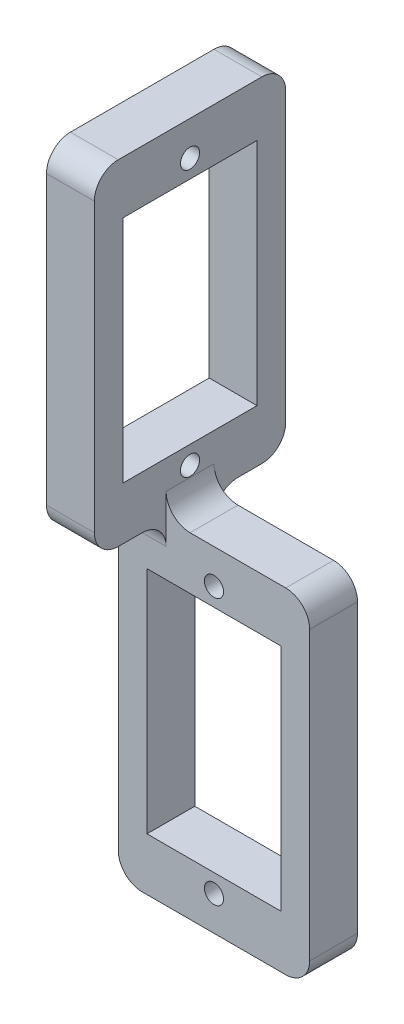
ISO-10303-21;
HEADER;
FILE_DESCRIPTION(('STEP AP214'),'2;1');
FILE_NAME('part.step','',(''),(''),'','','');
FILE_SCHEMA(('AUTOMOTIVE_DESIGN { 1 0 10303 214 1 1 1 1 }'));
ENDSEC;
DATA;
#1=APPLICATION_CONTEXT('core data for automotive mechanical design processes');
#2=APPLICATION_PROTOCOL_DEFINITION('international standard','automotive_design',2000,#1);
#3=PRODUCT_CONTEXT('',#1,'mechanical');
#4=PRODUCT('Part','Part','',(#3));
#5=PRODUCT_RELATED_PRODUCT_CATEGORY('part','',(#4));
#6=PRODUCT_DEFINITION_FORMATION('','',#4);
#7=PRODUCT_DEFINITION_CONTEXT('part definition',#1,'design');
#8=PRODUCT_DEFINITION('design','',#6,#7);
#9=PRODUCT_DEFINITION_SHAPE('','',#8);
#10=(LENGTH_UNIT() NAMED_UNIT(*) SI_UNIT(.MILLI.,.METRE.));
#11=(NAMED_UNIT(*) PLANE_ANGLE_UNIT() SI_UNIT($,.RADIAN.));
#12=(NAMED_UNIT(*) SI_UNIT($,.STERADIAN.) SOLID_ANGLE_UNIT());
#13=UNCERTAINTY_MEASURE_WITH_UNIT(LENGTH_MEASURE(1.E-05),#10,'distance_accuracy_value','');
#14=(GEOMETRIC_REPRESENTATION_CONTEXT(3) GLOBAL_UNCERTAINTY_ASSIGNED_CONTEXT((#13)) GLOBAL_UNIT_ASSIGNED_CONTEXT((#10,
#11,#12)) REPRESENTATION_CONTEXT('',''));
#15=CARTESIAN_POINT('',(0.,0.,0.));
#16=DIRECTION('',(0.,0.,1.));
#17=DIRECTION('',(1.,0.,0.));
#18=AXIS2_PLACEMENT_3D('',#15,#16,#17);
#19=CARTESIAN_POINT('',(0.,0.,5.));
#20=DIRECTION('',(0.,0.,-1.));
#21=DIRECTION('',(-1.,0.,0.));
#22=AXIS2_PLACEMENT_3D('',#19,#20,#21);
#23=PLANE('',#22);
#24=CARTESIAN_POINT('',(0.,13.9,5.));
#25=DIRECTION('',(0.,0.,1.));
#26=DIRECTION('',(1.,0.,0.));
#27=AXIS2_PLACEMENT_3D('',#24,#25,#26);
#28=CIRCLE('',#27,1.);
#29=CARTESIAN_POINT('',(1.,13.9,5.));
#30=VERTEX_POINT('',#29);
#31=EDGE_CURVE('E293',#30,#30,#28,.T.);
#32=ORIENTED_EDGE('',*,*,#31,.F.);
#33=EDGE_LOOP('',(#32));
#34=FACE_BOUND('',#33,.T.);
#35=CARTESIAN_POINT('',(0.,-13.9,5.));
#36=DIRECTION('',(0.,0.,1.));
#37=DIRECTION('',(-1.,0.,0.));
#38=AXIS2_PLACEMENT_3D('',#35,#36,#37);
#39=CIRCLE('',#38,1.);
#40=CARTESIAN_POINT('',(-1.,-13.9,5.));
#41=VERTEX_POINT('',#40);
#42=EDGE_CURVE('E278',#41,#41,#39,.T.);
#43=ORIENTED_EDGE('',*,*,#42,.F.);
#44=EDGE_LOOP('',(#43));
#45=FACE_BOUND('',#44,.T.);
#46=DIRECTION('',(0.,1.,0.));
#47=VECTOR('',#46,1.);
#48=CARTESIAN_POINT('',(10.,-17.5,5.));
#49=LINE('',#48,#47);
#50=CARTESIAN_POINT('',(10.,-15.,5.));
#51=VERTEX_POINT('',#50);
#52=CARTESIAN_POINT('',(10.,15.,5.));
#53=VERTEX_POINT('',#52);
#54=EDGE_CURVE('E332',#51,#53,#49,.T.);
#55=ORIENTED_EDGE('',*,*,#54,.T.);
#56=CARTESIAN_POINT('',(7.5,15.,5.));
#57=DIRECTION('',(0.,0.,-1.));
#58=DIRECTION('',(-1.,0.,0.));
#59=AXIS2_PLACEMENT_3D('',#56,#57,#58);
#60=CIRCLE('',#59,2.5);
#61=CARTESIAN_POINT('',(7.5,17.5,5.));
#62=VERTEX_POINT('',#61);
#63=EDGE_CURVE('E442',#53,#62,#60,.F.);
#64=ORIENTED_EDGE('',*,*,#63,.T.);
#65=DIRECTION('',(-1.,0.,0.));
#66=VECTOR('',#65,1.);
#67=CARTESIAN_POINT('',(-10.,17.5,5.));
#68=LINE('',#67,#66);
#69=CARTESIAN_POINT('',(-2.5,17.5,5.));
#70=VERTEX_POINT('',#69);
#71=EDGE_CURVE('E335',#62,#70,#68,.T.);
#72=ORIENTED_EDGE('',*,*,#71,.T.);
#73=CARTESIAN_POINT('',(-2.5,20.,5.));
#74=DIRECTION('',(0.,0.,-1.));
#75=DIRECTION('',(-1.,0.,0.));
#76=AXIS2_PLACEMENT_3D('',#73,#74,#75);
#77=CIRCLE('',#76,2.5);
#78=CARTESIAN_POINT('',(-5.,20.,5.));
#79=VERTEX_POINT('',#78);
#80=EDGE_CURVE('E45',#70,#79,#77,.T.);
#81=ORIENTED_EDGE('',*,*,#80,.T.);
#82=DIRECTION('',(0.,-1.,0.));
#83=VECTOR('',#82,1.);
#84=CARTESIAN_POINT('',(-5.,0.,5.));
#85=LINE('',#84,#83);
#86=CARTESIAN_POINT('',(-5.,15.,5.));
#87=VERTEX_POINT('',#86);
#88=EDGE_CURVE('E345',#79,#87,#85,.T.);
#89=ORIENTED_EDGE('',*,*,#88,.T.);
#90=DIRECTION('',(-1.,0.,0.));
#91=VECTOR('',#90,1.);
#92=CARTESIAN_POINT('',(0.,15.,5.));
#93=LINE('',#92,#91);
#94=CARTESIAN_POINT('',(-10.,15.,5.));
#95=VERTEX_POINT('',#94);
#96=EDGE_CURVE('E358',#87,#95,#93,.T.);
#97=ORIENTED_EDGE('',*,*,#96,.T.);
#98=DIRECTION('',(0.,-1.,0.));
#99=VECTOR('',#98,1.);
#100=CARTESIAN_POINT('',(-10.,-17.5,5.));
#101=LINE('',#100,#99);
#102=CARTESIAN_POINT('',(-10.,-15.,5.));
#103=VERTEX_POINT('',#102);
#104=EDGE_CURVE('E339',#95,#103,#101,.T.);
#105=ORIENTED_EDGE('',*,*,#104,.T.);
#106=CARTESIAN_POINT('',(-7.5,-15.,5.));
#107=DIRECTION('',(0.,0.,-1.));
#108=DIRECTION('',(-1.,0.,0.));
#109=AXIS2_PLACEMENT_3D('',#106,#107,#108);
#110=CIRCLE('',#109,2.5);
#111=CARTESIAN_POINT('',(-7.5,-17.5,5.));
#112=VERTEX_POINT('',#111);
#113=EDGE_CURVE('E440',#103,#112,#110,.F.);
#114=ORIENTED_EDGE('',*,*,#113,.T.);
#115=DIRECTION('',(1.,0.,0.));
#116=VECTOR('',#115,1.);
#117=CARTESIAN_POINT('',(-10.,-17.5,5.));
#118=LINE('',#117,#116);
#119=CARTESIAN_POINT('',(7.5,-17.5,5.));
#120=VERTEX_POINT('',#119);
#121=EDGE_CURVE('E342',#112,#120,#118,.T.);
#122=ORIENTED_EDGE('',*,*,#121,.T.);
#123=CARTESIAN_POINT('',(7.5,-15.,5.));
#124=DIRECTION('',(0.,0.,-1.));
#125=DIRECTION('',(-1.,0.,0.));
#126=AXIS2_PLACEMENT_3D('',#123,#124,#125);
#127=CIRCLE('',#126,2.5);
#128=EDGE_CURVE('E438',#120,#51,#127,.F.);
#129=ORIENTED_EDGE('',*,*,#128,.T.);
#130=EDGE_LOOP('',(#55,#64,#72,#81,#89,#97,#105,#114,#122,#129));
#131=FACE_BOUND('',#130,.T.);
#132=DIRECTION('',(0.,1.,0.));
#133=VECTOR('',#132,1.);
#134=CARTESIAN_POINT('',(7.,-12.,5.));
#135=LINE('',#134,#133);
#136=CARTESIAN_POINT('',(7.,-12.,5.));
#137=VERTEX_POINT('',#136);
#138=CARTESIAN_POINT('',(7.,12.,5.));
#139=VERTEX_POINT('',#138);
#140=EDGE_CURVE('E301',#137,#139,#135,.T.);
#141=ORIENTED_EDGE('',*,*,#140,.F.);
#142=DIRECTION('',(1.,0.,0.));
#143=VECTOR('',#142,1.);
#144=CARTESIAN_POINT('',(-7.,-12.,5.));
#145=LINE('',#144,#143);
#146=CARTESIAN_POINT('',(-7.,-12.,5.));
#147=VERTEX_POINT('',#146);
#148=EDGE_CURVE('E309',#147,#137,#145,.T.);
#149=ORIENTED_EDGE('',*,*,#148,.F.);
#150=DIRECTION('',(0.,-1.,0.));
#151=VECTOR('',#150,1.);
#152=CARTESIAN_POINT('',(-7.,-12.,5.));
#153=LINE('',#152,#151);
#154=CARTESIAN_POINT('',(-7.,12.,5.));
#155=VERTEX_POINT('',#154);
#156=EDGE_CURVE('E306',#155,#147,#153,.T.);
#157=ORIENTED_EDGE('',*,*,#156,.F.);
#158=DIRECTION('',(-1.,0.,0.));
#159=VECTOR('',#158,1.);
#160=CARTESIAN_POINT('',(-7.,12.,5.));
#161=LINE('',#160,#159);
#162=EDGE_CURVE('E303',#139,#155,#161,.T.);
#163=ORIENTED_EDGE('',*,*,#162,.F.);
#164=EDGE_LOOP('',(#141,#149,#157,#163));
#165=FACE_BOUND('',#164,.T.);
#166=ADVANCED_FACE('F37',(#34,#45,#131,#165),#23,.F.);
#167=CARTESIAN_POINT('',(0.,0.,0.));
#168=DIRECTION('',(0.,0.,-1.));
#169=DIRECTION('',(-1.,0.,0.));
#170=AXIS2_PLACEMENT_3D('',#167,#168,#169);
#171=PLANE('',#170);
#172=CARTESIAN_POINT('',(0.,13.9,0.));
#173=DIRECTION('',(0.,0.,1.));
#174=DIRECTION('',(1.,0.,0.));
#175=AXIS2_PLACEMENT_3D('',#172,#173,#174);
#176=CIRCLE('',#175,1.);
#177=CARTESIAN_POINT('',(1.,13.9,0.));
#178=VERTEX_POINT('',#177);
#179=EDGE_CURVE('E289',#178,#178,#176,.T.);
#180=ORIENTED_EDGE('',*,*,#179,.T.);
#181=EDGE_LOOP('',(#180));
#182=FACE_BOUND('',#181,.T.);
#183=CARTESIAN_POINT('',(0.,-13.9,0.));
#184=DIRECTION('',(0.,0.,1.));
#185=DIRECTION('',(-1.,0.,0.));
#186=AXIS2_PLACEMENT_3D('',#183,#184,#185);
#187=CIRCLE('',#186,1.);
#188=CARTESIAN_POINT('',(-1.,-13.9,0.));
#189=VERTEX_POINT('',#188);
#190=EDGE_CURVE('E296',#189,#189,#187,.T.);
#191=ORIENTED_EDGE('',*,*,#190,.T.);
#192=EDGE_LOOP('',(#191));
#193=FACE_BOUND('',#192,.T.);
#194=DIRECTION('',(-1.,0.,0.));
#195=VECTOR('',#194,1.);
#196=CARTESIAN_POINT('',(-10.,17.5,0.));
#197=LINE('',#196,#195);
#198=CARTESIAN_POINT('',(7.5,17.5,0.));
#199=VERTEX_POINT('',#198);
#200=CARTESIAN_POINT('',(-2.5,17.5,0.));
#201=VERTEX_POINT('',#200);
#202=EDGE_CURVE('E348',#199,#201,#197,.T.);
#203=ORIENTED_EDGE('',*,*,#202,.F.);
#204=CARTESIAN_POINT('',(7.5,15.,0.));
#205=DIRECTION('',(0.,0.,-1.));
#206=DIRECTION('',(-1.,0.,0.));
#207=AXIS2_PLACEMENT_3D('',#204,#205,#206);
#208=CIRCLE('',#207,2.5);
#209=CARTESIAN_POINT('',(10.,15.,0.));
#210=VERTEX_POINT('',#209);
#211=EDGE_CURVE('E431',#199,#210,#208,.T.);
#212=ORIENTED_EDGE('',*,*,#211,.T.);
#213=DIRECTION('',(0.,1.,0.));
#214=VECTOR('',#213,1.);
#215=CARTESIAN_POINT('',(10.,-17.5,0.));
#216=LINE('',#215,#214);
#217=CARTESIAN_POINT('',(10.,-15.,0.));
#218=VERTEX_POINT('',#217);
#219=EDGE_CURVE('E331',#218,#210,#216,.T.);
#220=ORIENTED_EDGE('',*,*,#219,.F.);
#221=CARTESIAN_POINT('',(7.5,-15.,0.));
#222=DIRECTION('',(0.,0.,-1.));
#223=DIRECTION('',(-1.,0.,0.));
#224=AXIS2_PLACEMENT_3D('',#221,#222,#223);
#225=CIRCLE('',#224,2.5);
#226=CARTESIAN_POINT('',(7.5,-17.5,0.));
#227=VERTEX_POINT('',#226);
#228=EDGE_CURVE('E427',#218,#227,#225,.T.);
#229=ORIENTED_EDGE('',*,*,#228,.T.);
#230=DIRECTION('',(1.,0.,0.));
#231=VECTOR('',#230,1.);
#232=CARTESIAN_POINT('',(-10.,-17.5,0.));
#233=LINE('',#232,#231);
#234=CARTESIAN_POINT('',(-7.5,-17.5,0.));
#235=VERTEX_POINT('',#234);
#236=EDGE_CURVE('E336',#235,#227,#233,.T.);
#237=ORIENTED_EDGE('',*,*,#236,.F.);
#238=CARTESIAN_POINT('',(-7.5,-15.,0.));
#239=DIRECTION('',(0.,0.,-1.));
#240=DIRECTION('',(-1.,0.,0.));
#241=AXIS2_PLACEMENT_3D('',#238,#239,#240);
#242=CIRCLE('',#241,2.5);
#243=CARTESIAN_POINT('',(-10.,-15.,0.));
#244=VERTEX_POINT('',#243);
#245=EDGE_CURVE('E429',#235,#244,#242,.T.);
#246=ORIENTED_EDGE('',*,*,#245,.T.);
#247=DIRECTION('',(0.,-1.,0.));
#248=VECTOR('',#247,1.);
#249=CARTESIAN_POINT('',(-10.,-17.5,0.));
#250=LINE('',#249,#248);
#251=CARTESIAN_POINT('',(-10.,15.,0.));
#252=VERTEX_POINT('',#251);
#253=EDGE_CURVE('E351',#252,#244,#250,.T.);
#254=ORIENTED_EDGE('',*,*,#253,.F.);
#255=DIRECTION('',(-1.,0.,0.));
#256=VECTOR('',#255,1.);
#257=CARTESIAN_POINT('',(-5.,15.,0.));
#258=LINE('',#257,#256);
#259=CARTESIAN_POINT('',(-5.,15.,0.));
#260=VERTEX_POINT('',#259);
#261=EDGE_CURVE('E368',#252,#260,#258,.F.);
#262=ORIENTED_EDGE('',*,*,#261,.T.);
#263=DIRECTION('',(0.,1.,0.));
#264=VECTOR('',#263,1.);
#265=CARTESIAN_POINT('',(-5.,0.,0.));
#266=LINE('',#265,#264);
#267=CARTESIAN_POINT('',(-5.,20.,0.));
#268=VERTEX_POINT('',#267);
#269=EDGE_CURVE('E366',#260,#268,#266,.T.);
#270=ORIENTED_EDGE('',*,*,#269,.T.);
#271=CARTESIAN_POINT('',(-2.5,20.,0.));
#272=DIRECTION('',(0.,0.,-1.));
#273=DIRECTION('',(-1.,0.,0.));
#274=AXIS2_PLACEMENT_3D('',#271,#272,#273);
#275=CIRCLE('',#274,2.5);
#276=EDGE_CURVE('E11',#268,#201,#275,.F.);
#277=ORIENTED_EDGE('',*,*,#276,.T.);
#278=EDGE_LOOP('',(#203,#212,#220,#229,#237,#246,#254,#262,#270,#277));
#279=FACE_BOUND('',#278,.T.);
#280=DIRECTION('',(1.,0.,0.));
#281=VECTOR('',#280,1.);
#282=CARTESIAN_POINT('',(-7.,-12.,0.));
#283=LINE('',#282,#281);
#284=CARTESIAN_POINT('',(-7.,-12.,0.));
#285=VERTEX_POINT('',#284);
#286=CARTESIAN_POINT('',(7.,-12.,0.));
#287=VERTEX_POINT('',#286);
#288=EDGE_CURVE('E304',#285,#287,#283,.T.);
#289=ORIENTED_EDGE('',*,*,#288,.T.);
#290=DIRECTION('',(0.,1.,0.));
#291=VECTOR('',#290,1.);
#292=CARTESIAN_POINT('',(7.,-12.,0.));
#293=LINE('',#292,#291);
#294=CARTESIAN_POINT('',(7.,12.,0.));
#295=VERTEX_POINT('',#294);
#296=EDGE_CURVE('E292',#287,#295,#293,.T.);
#297=ORIENTED_EDGE('',*,*,#296,.T.);
#298=DIRECTION('',(-1.,0.,0.));
#299=VECTOR('',#298,1.);
#300=CARTESIAN_POINT('',(-7.,12.,0.));
#301=LINE('',#300,#299);
#302=CARTESIAN_POINT('',(-7.,12.,0.));
#303=VERTEX_POINT('',#302);
#304=EDGE_CURVE('E314',#295,#303,#301,.T.);
#305=ORIENTED_EDGE('',*,*,#304,.T.);
#306=DIRECTION('',(0.,-1.,0.));
#307=VECTOR('',#306,1.);
#308=CARTESIAN_POINT('',(-7.,-12.,0.));
#309=LINE('',#308,#307);
#310=EDGE_CURVE('E317',#303,#285,#309,.T.);
#311=ORIENTED_EDGE('',*,*,#310,.T.);
#312=EDGE_LOOP('',(#289,#297,#305,#311));
#313=FACE_BOUND('',#312,.T.);
#314=ADVANCED_FACE('F496',(#182,#193,#279,#313),#171,.T.);
#315=CARTESIAN_POINT('',(10.,-17.5,5.));
#316=DIRECTION('',(-1.,0.,0.));
#317=DIRECTION('',(0.,0.,1.));
#318=AXIS2_PLACEMENT_3D('',#315,#316,#317);
#319=PLANE('',#318);
#320=ORIENTED_EDGE('',*,*,#219,.T.);
#321=DIRECTION('',(0.,0.,-1.));
#322=VECTOR('',#321,1.);
#323=CARTESIAN_POINT('',(10.,15.,5.));
#324=LINE('',#323,#322);
#325=EDGE_CURVE('E436',#210,#53,#324,.F.);
#326=ORIENTED_EDGE('',*,*,#325,.T.);
#327=ORIENTED_EDGE('',*,*,#54,.F.);
#328=DIRECTION('',(0.,0.,-1.));
#329=VECTOR('',#328,1.);
#330=CARTESIAN_POINT('',(10.,-15.,5.));
#331=LINE('',#330,#329);
#332=EDGE_CURVE('E433',#51,#218,#331,.T.);
#333=ORIENTED_EDGE('',*,*,#332,.T.);
#334=EDGE_LOOP('',(#320,#326,#327,#333));
#335=FACE_BOUND('',#334,.T.);
#336=ADVANCED_FACE('F486',(#335),#319,.F.);
#337=CARTESIAN_POINT('',(-10.,17.5,5.));
#338=DIRECTION('',(0.,-1.,0.));
#339=DIRECTION('',(0.,0.,-1.));
#340=AXIS2_PLACEMENT_3D('',#337,#338,#339);
#341=PLANE('',#340);
#342=ORIENTED_EDGE('',*,*,#202,.T.);
#343=DIRECTION('',(0.,0.,1.));
#344=VECTOR('',#343,1.);
#345=CARTESIAN_POINT('',(-2.5,17.5,5.));
#346=LINE('',#345,#344);
#347=EDGE_CURVE('E424',#201,#70,#346,.T.);
#348=ORIENTED_EDGE('',*,*,#347,.T.);
#349=ORIENTED_EDGE('',*,*,#71,.F.);
#350=DIRECTION('',(0.,0.,-1.));
#351=VECTOR('',#350,1.);
#352=CARTESIAN_POINT('',(7.5,17.5,5.));
#353=LINE('',#352,#351);
#354=EDGE_CURVE('E421',#62,#199,#353,.T.);
#355=ORIENTED_EDGE('',*,*,#354,.T.);
#356=EDGE_LOOP('',(#342,#348,#349,#355));
#357=FACE_BOUND('',#356,.T.);
#358=ADVANCED_FACE('F493',(#357),#341,.F.);
#359=CARTESIAN_POINT('',(-10.,-17.5,5.));
#360=DIRECTION('',(1.,0.,0.));
#361=DIRECTION('',(0.,0.,-1.));
#362=AXIS2_PLACEMENT_3D('',#359,#360,#361);
#363=PLANE('',#362);
#364=CARTESIAN_POINT('',(-10.,48.9,2.5));
#365=DIRECTION('',(1.,0.,0.));
#366=DIRECTION('',(0.,0.,-1.));
#367=AXIS2_PLACEMENT_3D('',#364,#365,#366);
#368=CIRCLE('',#367,1.);
#369=CARTESIAN_POINT('',(-10.,48.9,1.5));
#370=VERTEX_POINT('',#369);
#371=EDGE_CURVE('E261',#370,#370,#368,.T.);
#372=ORIENTED_EDGE('',*,*,#371,.T.);
#373=EDGE_LOOP('',(#372));
#374=FACE_BOUND('',#373,.T.);
#375=CARTESIAN_POINT('',(-10.,21.1,2.49999999999999));
#376=DIRECTION('',(1.,0.,0.));
#377=DIRECTION('',(0.,0.,-1.));
#378=AXIS2_PLACEMENT_3D('',#375,#376,#377);
#379=CIRCLE('',#378,1.);
#380=CARTESIAN_POINT('',(-10.,21.1,1.49999999999999));
#381=VERTEX_POINT('',#380);
#382=EDGE_CURVE('E258',#381,#381,#379,.T.);
#383=ORIENTED_EDGE('',*,*,#382,.T.);
#384=EDGE_LOOP('',(#383));
#385=FACE_BOUND('',#384,.T.);
#386=DIRECTION('',(0.,0.,-1.));
#387=VECTOR('',#386,1.);
#388=CARTESIAN_POINT('',(-10.,23.,5.));
#389=LINE('',#388,#387);
#390=CARTESIAN_POINT('',(-10.,23.,9.5));
#391=VERTEX_POINT('',#390);
#392=CARTESIAN_POINT('',(-10.,23.,-4.5));
#393=VERTEX_POINT('',#392);
#394=EDGE_CURVE('E252',#391,#393,#389,.T.);
#395=ORIENTED_EDGE('',*,*,#394,.T.);
#396=DIRECTION('',(0.,1.,0.));
#397=VECTOR('',#396,1.);
#398=CARTESIAN_POINT('',(-10.,-17.5,-4.5));
#399=LINE('',#398,#397);
#400=CARTESIAN_POINT('',(-10.,47.,-4.5));
#401=VERTEX_POINT('',#400);
#402=EDGE_CURVE('E255',#393,#401,#399,.T.);
#403=ORIENTED_EDGE('',*,*,#402,.T.);
#404=DIRECTION('',(0.,0.,1.));
#405=VECTOR('',#404,1.);
#406=CARTESIAN_POINT('',(-10.,47.,5.));
#407=LINE('',#406,#405);
#408=CARTESIAN_POINT('',(-10.,47.,9.5));
#409=VERTEX_POINT('',#408);
#410=EDGE_CURVE('E247',#401,#409,#407,.T.);
#411=ORIENTED_EDGE('',*,*,#410,.T.);
#412=DIRECTION('',(0.,-1.,0.));
#413=VECTOR('',#412,1.);
#414=CARTESIAN_POINT('',(-10.,-17.5,9.5));
#415=LINE('',#414,#413);
#416=EDGE_CURVE('E227',#409,#391,#415,.T.);
#417=ORIENTED_EDGE('',*,*,#416,.T.);
#418=EDGE_LOOP('',(#395,#403,#411,#417));
#419=FACE_BOUND('',#418,.T.);
#420=DIRECTION('',(0.,0.,-1.));
#421=VECTOR('',#420,1.);
#422=CARTESIAN_POINT('',(-10.,52.5,0.));
#423=LINE('',#422,#421);
#424=CARTESIAN_POINT('',(-10.,52.5,10.));
#425=VERTEX_POINT('',#424);
#426=CARTESIAN_POINT('',(-10.,52.5,-5.00000000000001));
#427=VERTEX_POINT('',#426);
#428=EDGE_CURVE('E269',#425,#427,#423,.T.);
#429=ORIENTED_EDGE('',*,*,#428,.T.);
#430=CARTESIAN_POINT('',(-10.,50.,-5.00000000000001));
#431=DIRECTION('',(1.,0.,0.));
#432=DIRECTION('',(0.,0.,-1.));
#433=AXIS2_PLACEMENT_3D('',#430,#431,#432);
#434=CIRCLE('',#433,2.5);
#435=CARTESIAN_POINT('',(-10.,50.,-7.50000000000001));
#436=VERTEX_POINT('',#435);
#437=EDGE_CURVE('E393',#427,#436,#434,.F.);
#438=ORIENTED_EDGE('',*,*,#437,.T.);
#439=DIRECTION('',(0.,1.,0.));
#440=VECTOR('',#439,1.);
#441=CARTESIAN_POINT('',(-10.,0.,-7.5));
#442=LINE('',#441,#440);
#443=CARTESIAN_POINT('',(-10.,20.,-7.5));
#444=VERTEX_POINT('',#443);
#445=EDGE_CURVE('E264',#444,#436,#442,.T.);
#446=ORIENTED_EDGE('',*,*,#445,.F.);
#447=CARTESIAN_POINT('',(-10.,20.,-5.));
#448=DIRECTION('',(1.,0.,0.));
#449=DIRECTION('',(0.,0.,-1.));
#450=AXIS2_PLACEMENT_3D('',#447,#448,#449);
#451=CIRCLE('',#450,2.5);
#452=CARTESIAN_POINT('',(-10.,17.5,-5.));
#453=VERTEX_POINT('',#452);
#454=EDGE_CURVE('E389',#444,#453,#451,.F.);
#455=ORIENTED_EDGE('',*,*,#454,.T.);
#456=DIRECTION('',(0.,0.,1.));
#457=VECTOR('',#456,1.);
#458=CARTESIAN_POINT('',(-10.,17.5,0.));
#459=LINE('',#458,#457);
#460=CARTESIAN_POINT('',(-10.,17.5,-2.5));
#461=VERTEX_POINT('',#460);
#462=EDGE_CURVE('E282',#453,#461,#459,.T.);
#463=ORIENTED_EDGE('',*,*,#462,.T.);
#464=CARTESIAN_POINT('',(-10.,15.,-2.5));
#465=DIRECTION('',(1.,0.,0.));
#466=DIRECTION('',(0.,0.,-1.));
#467=AXIS2_PLACEMENT_3D('',#464,#465,#466);
#468=CIRCLE('',#467,2.5);
#469=EDGE_CURVE('E375',#461,#252,#468,.T.);
#470=ORIENTED_EDGE('',*,*,#469,.T.);
#471=ORIENTED_EDGE('',*,*,#253,.T.);
#472=DIRECTION('',(0.,0.,-1.));
#473=VECTOR('',#472,1.);
#474=CARTESIAN_POINT('',(-10.,-15.,5.));
#475=LINE('',#474,#473);
#476=EDGE_CURVE('E385',#244,#103,#475,.F.);
#477=ORIENTED_EDGE('',*,*,#476,.T.);
#478=ORIENTED_EDGE('',*,*,#104,.F.);
#479=CARTESIAN_POINT('',(-10.,15.,7.5));
#480=DIRECTION('',(1.,0.,0.));
#481=DIRECTION('',(0.,0.,-1.));
#482=AXIS2_PLACEMENT_3D('',#479,#480,#481);
#483=CIRCLE('',#482,2.5);
#484=CARTESIAN_POINT('',(-10.,17.5,7.5));
#485=VERTEX_POINT('',#484);
#486=EDGE_CURVE('E371',#95,#485,#483,.T.);
#487=ORIENTED_EDGE('',*,*,#486,.T.);
#488=CARTESIAN_POINT('',(-10.,17.5,10.));
#489=VERTEX_POINT('',#488);
#490=EDGE_CURVE('E281',#485,#489,#459,.T.);
#491=ORIENTED_EDGE('',*,*,#490,.T.);
#492=CARTESIAN_POINT('',(-10.,20.,10.));
#493=DIRECTION('',(1.,0.,0.));
#494=DIRECTION('',(0.,0.,-1.));
#495=AXIS2_PLACEMENT_3D('',#492,#493,#494);
#496=CIRCLE('',#495,2.5);
#497=CARTESIAN_POINT('',(-10.,20.,12.5));
#498=VERTEX_POINT('',#497);
#499=EDGE_CURVE('E387',#489,#498,#496,.F.);
#500=ORIENTED_EDGE('',*,*,#499,.T.);
#501=DIRECTION('',(0.,1.,0.));
#502=VECTOR('',#501,1.);
#503=CARTESIAN_POINT('',(-10.,0.,12.5));
#504=LINE('',#503,#502);
#505=CARTESIAN_POINT('',(-10.,50.,12.5));
#506=VERTEX_POINT('',#505);
#507=EDGE_CURVE('E284',#498,#506,#504,.T.);
#508=ORIENTED_EDGE('',*,*,#507,.T.);
#509=CARTESIAN_POINT('',(-10.,50.,10.));
#510=DIRECTION('',(1.,0.,0.));
#511=DIRECTION('',(0.,0.,-1.));
#512=AXIS2_PLACEMENT_3D('',#509,#510,#511);
#513=CIRCLE('',#512,2.5);
#514=EDGE_CURVE('E391',#506,#425,#513,.F.);
#515=ORIENTED_EDGE('',*,*,#514,.T.);
#516=EDGE_LOOP('',(#429,#438,#446,#455,#463,#470,#471,#477,#478,#487,#491,#500,#508,#515));
#517=FACE_BOUND('',#516,.T.);
#518=ADVANCED_FACE('F467',(#374,#385,#419,#517),#363,.F.);
#519=CARTESIAN_POINT('',(-10.,-17.5,5.));
#520=DIRECTION('',(0.,1.,0.));
#521=DIRECTION('',(0.,0.,1.));
#522=AXIS2_PLACEMENT_3D('',#519,#520,#521);
#523=PLANE('',#522);
#524=ORIENTED_EDGE('',*,*,#121,.F.);
#525=DIRECTION('',(0.,0.,-1.));
#526=VECTOR('',#525,1.);
#527=CARTESIAN_POINT('',(-7.5,-17.5,5.));
#528=LINE('',#527,#526);
#529=EDGE_CURVE('E446',#112,#235,#528,.T.);
#530=ORIENTED_EDGE('',*,*,#529,.T.);
#531=ORIENTED_EDGE('',*,*,#236,.T.);
#532=DIRECTION('',(0.,0.,-1.));
#533=VECTOR('',#532,1.);
#534=CARTESIAN_POINT('',(7.5,-17.5,5.));
#535=LINE('',#534,#533);
#536=EDGE_CURVE('E444',#227,#120,#535,.F.);
#537=ORIENTED_EDGE('',*,*,#536,.T.);
#538=EDGE_LOOP('',(#524,#530,#531,#537));
#539=FACE_BOUND('',#538,.T.);
#540=ADVANCED_FACE('F478',(#539),#523,.F.);
#541=CARTESIAN_POINT('',(7.,-12.,5.));
#542=DIRECTION('',(-1.,0.,0.));
#543=DIRECTION('',(0.,0.,1.));
#544=AXIS2_PLACEMENT_3D('',#541,#542,#543);
#545=PLANE('',#544);
#546=ORIENTED_EDGE('',*,*,#296,.F.);
#547=DIRECTION('',(0.,0.,-1.));
#548=VECTOR('',#547,1.);
#549=CARTESIAN_POINT('',(7.,-12.,5.));
#550=LINE('',#549,#548);
#551=EDGE_CURVE('E311',#137,#287,#550,.T.);
#552=ORIENTED_EDGE('',*,*,#551,.F.);
#553=ORIENTED_EDGE('',*,*,#140,.T.);
#554=DIRECTION('',(0.,0.,-1.));
#555=VECTOR('',#554,1.);
#556=CARTESIAN_POINT('',(7.,12.,5.));
#557=LINE('',#556,#555);
#558=EDGE_CURVE('E328',#139,#295,#557,.T.);
#559=ORIENTED_EDGE('',*,*,#558,.T.);
#560=EDGE_LOOP('',(#546,#552,#553,#559));
#561=FACE_BOUND('',#560,.T.);
#562=ADVANCED_FACE('F566',(#561),#545,.T.);
#563=CARTESIAN_POINT('',(-7.,12.,5.));
#564=DIRECTION('',(0.,-1.,0.));
#565=DIRECTION('',(0.,0.,-1.));
#566=AXIS2_PLACEMENT_3D('',#563,#564,#565);
#567=PLANE('',#566);
#568=ORIENTED_EDGE('',*,*,#304,.F.);
#569=ORIENTED_EDGE('',*,*,#558,.F.);
#570=ORIENTED_EDGE('',*,*,#162,.T.);
#571=DIRECTION('',(0.,0.,-1.));
#572=VECTOR('',#571,1.);
#573=CARTESIAN_POINT('',(-7.,12.,5.));
#574=LINE('',#573,#572);
#575=EDGE_CURVE('E326',#155,#303,#574,.T.);
#576=ORIENTED_EDGE('',*,*,#575,.T.);
#577=EDGE_LOOP('',(#568,#569,#570,#576));
#578=FACE_BOUND('',#577,.T.);
#579=ADVANCED_FACE('F692',(#578),#567,.T.);
#580=CARTESIAN_POINT('',(-7.,-12.,5.));
#581=DIRECTION('',(1.,0.,0.));
#582=DIRECTION('',(0.,0.,-1.));
#583=AXIS2_PLACEMENT_3D('',#580,#581,#582);
#584=PLANE('',#583);
#585=ORIENTED_EDGE('',*,*,#310,.F.);
#586=ORIENTED_EDGE('',*,*,#575,.F.);
#587=ORIENTED_EDGE('',*,*,#156,.T.);
#588=DIRECTION('',(0.,0.,-1.));
#589=VECTOR('',#588,1.);
#590=CARTESIAN_POINT('',(-7.,-12.,5.));
#591=LINE('',#590,#589);
#592=EDGE_CURVE('E324',#147,#285,#591,.T.);
#593=ORIENTED_EDGE('',*,*,#592,.T.);
#594=EDGE_LOOP('',(#585,#586,#587,#593));
#595=FACE_BOUND('',#594,.T.);
#596=ADVANCED_FACE('F699',(#595),#584,.T.);
#597=CARTESIAN_POINT('',(-7.,-12.,5.));
#598=DIRECTION('',(0.,1.,0.));
#599=DIRECTION('',(0.,0.,1.));
#600=AXIS2_PLACEMENT_3D('',#597,#598,#599);
#601=PLANE('',#600);
#602=ORIENTED_EDGE('',*,*,#288,.F.);
#603=ORIENTED_EDGE('',*,*,#592,.F.);
#604=ORIENTED_EDGE('',*,*,#148,.T.);
#605=ORIENTED_EDGE('',*,*,#551,.T.);
#606=EDGE_LOOP('',(#602,#603,#604,#605));
#607=FACE_BOUND('',#606,.T.);
#608=ADVANCED_FACE('F706',(#607),#601,.T.);
#609=CARTESIAN_POINT('',(0.,-13.9,0.));
#610=DIRECTION('',(0.,0.,1.));
#611=DIRECTION('',(1.,0.,0.));
#612=AXIS2_PLACEMENT_3D('',#609,#610,#611);
#613=CYLINDRICAL_SURFACE('',#612,1.);
#614=ORIENTED_EDGE('',*,*,#190,.F.);
#615=EDGE_LOOP('',(#614));
#616=FACE_BOUND('',#615,.T.);
#617=ORIENTED_EDGE('',*,*,#42,.T.);
#618=EDGE_LOOP('',(#617));
#619=FACE_BOUND('',#618,.T.);
#620=ADVANCED_FACE('F550',(#616,#619),#613,.F.);
#621=CARTESIAN_POINT('',(0.,13.9,0.));
#622=DIRECTION('',(0.,0.,1.));
#623=DIRECTION('',(1.,0.,0.));
#624=AXIS2_PLACEMENT_3D('',#621,#622,#623);
#625=CYLINDRICAL_SURFACE('',#624,1.);
#626=ORIENTED_EDGE('',*,*,#179,.F.);
#627=EDGE_LOOP('',(#626));
#628=FACE_BOUND('',#627,.T.);
#629=ORIENTED_EDGE('',*,*,#31,.T.);
#630=EDGE_LOOP('',(#629));
#631=FACE_BOUND('',#630,.T.);
#632=ADVANCED_FACE('F542',(#628,#631),#625,.F.);
#633=CARTESIAN_POINT('',(-5.,17.5,0.));
#634=DIRECTION('',(0.,-1.,0.));
#635=DIRECTION('',(0.,0.,-1.));
#636=AXIS2_PLACEMENT_3D('',#633,#634,#635);
#637=PLANE('',#636);
#638=DIRECTION('',(0.,0.,1.));
#639=VECTOR('',#638,1.);
#640=CARTESIAN_POINT('',(-5.,17.5,0.));
#641=LINE('',#640,#639);
#642=CARTESIAN_POINT('',(-5.,17.5,7.5));
#643=VERTEX_POINT('',#642);
#644=CARTESIAN_POINT('',(-5.,17.5,10.));
#645=VERTEX_POINT('',#644);
#646=EDGE_CURVE('E268',#643,#645,#641,.T.);
#647=ORIENTED_EDGE('',*,*,#646,.T.);
#648=DIRECTION('',(-1.,0.,0.));
#649=VECTOR('',#648,1.);
#650=CARTESIAN_POINT('',(-5.,17.5,10.));
#651=LINE('',#650,#649);
#652=EDGE_CURVE('E418',#645,#489,#651,.T.);
#653=ORIENTED_EDGE('',*,*,#652,.T.);
#654=ORIENTED_EDGE('',*,*,#490,.F.);
#655=DIRECTION('',(-1.,0.,0.));
#656=VECTOR('',#655,1.);
#657=CARTESIAN_POINT('',(-5.,17.5,7.5));
#658=LINE('',#657,#656);
#659=EDGE_CURVE('E361',#485,#643,#658,.F.);
#660=ORIENTED_EDGE('',*,*,#659,.T.);
#661=EDGE_LOOP('',(#647,#653,#654,#660));
#662=FACE_BOUND('',#661,.T.);
#663=ADVANCED_FACE('F540',(#662),#637,.T.);
#664=CARTESIAN_POINT('',(-5.,0.,-7.5));
#665=DIRECTION('',(0.,0.,1.));
#666=DIRECTION('',(0.,-1.,0.));
#667=AXIS2_PLACEMENT_3D('',#664,#665,#666);
#668=PLANE('',#667);
#669=ORIENTED_EDGE('',*,*,#445,.T.);
#670=DIRECTION('',(-1.,0.,0.));
#671=VECTOR('',#670,1.);
#672=CARTESIAN_POINT('',(-5.,50.,-7.50000000000001));
#673=LINE('',#672,#671);
#674=CARTESIAN_POINT('',(-5.,50.,-7.50000000000001));
#675=VERTEX_POINT('',#674);
#676=EDGE_CURVE('E398',#436,#675,#673,.F.);
#677=ORIENTED_EDGE('',*,*,#676,.T.);
#678=DIRECTION('',(0.,1.,0.));
#679=VECTOR('',#678,1.);
#680=CARTESIAN_POINT('',(-5.,0.,-7.5));
#681=LINE('',#680,#679);
#682=CARTESIAN_POINT('',(-5.,20.,-7.5));
#683=VERTEX_POINT('',#682);
#684=EDGE_CURVE('E265',#683,#675,#681,.T.);
#685=ORIENTED_EDGE('',*,*,#684,.F.);
#686=DIRECTION('',(-1.,0.,0.));
#687=VECTOR('',#686,1.);
#688=CARTESIAN_POINT('',(-10.,20.,-7.5));
#689=LINE('',#688,#687);
#690=EDGE_CURVE('E395',#683,#444,#689,.T.);
#691=ORIENTED_EDGE('',*,*,#690,.T.);
#692=EDGE_LOOP('',(#669,#677,#685,#691));
#693=FACE_BOUND('',#692,.T.);
#694=ADVANCED_FACE('F514',(#693),#668,.F.);
#695=CARTESIAN_POINT('',(-5.,52.5,0.));
#696=DIRECTION('',(0.,1.,0.));
#697=DIRECTION('',(0.,0.,1.));
#698=AXIS2_PLACEMENT_3D('',#695,#696,#697);
#699=PLANE('',#698);
#700=DIRECTION('',(0.,0.,-1.));
#701=VECTOR('',#700,1.);
#702=CARTESIAN_POINT('',(-5.,52.5,0.));
#703=LINE('',#702,#701);
#704=CARTESIAN_POINT('',(-5.,52.5,10.));
#705=VERTEX_POINT('',#704);
#706=CARTESIAN_POINT('',(-5.,52.5,-5.00000000000001));
#707=VERTEX_POINT('',#706);
#708=EDGE_CURVE('E275',#705,#707,#703,.T.);
#709=ORIENTED_EDGE('',*,*,#708,.T.);
#710=DIRECTION('',(-1.,0.,0.));
#711=VECTOR('',#710,1.);
#712=CARTESIAN_POINT('',(-10.,52.5,-5.00000000000001));
#713=LINE('',#712,#711);
#714=EDGE_CURVE('E382',#707,#427,#713,.T.);
#715=ORIENTED_EDGE('',*,*,#714,.T.);
#716=ORIENTED_EDGE('',*,*,#428,.F.);
#717=DIRECTION('',(-1.,0.,0.));
#718=VECTOR('',#717,1.);
#719=CARTESIAN_POINT('',(-5.,52.5,10.));
#720=LINE('',#719,#718);
#721=EDGE_CURVE('E380',#425,#705,#720,.F.);
#722=ORIENTED_EDGE('',*,*,#721,.T.);
#723=EDGE_LOOP('',(#709,#715,#716,#722));
#724=FACE_BOUND('',#723,.T.);
#725=ADVANCED_FACE('F523',(#724),#699,.T.);
#726=CARTESIAN_POINT('',(-5.,0.,12.5));
#727=DIRECTION('',(0.,0.,1.));
#728=DIRECTION('',(1.,0.,0.));
#729=AXIS2_PLACEMENT_3D('',#726,#727,#728);
#730=PLANE('',#729);
#731=DIRECTION('',(0.,1.,0.));
#732=VECTOR('',#731,1.);
#733=CARTESIAN_POINT('',(-5.,0.,12.5));
#734=LINE('',#733,#732);
#735=CARTESIAN_POINT('',(-5.,20.,12.5));
#736=VERTEX_POINT('',#735);
#737=CARTESIAN_POINT('',(-5.,50.,12.5));
#738=VERTEX_POINT('',#737);
#739=EDGE_CURVE('E272',#736,#738,#734,.T.);
#740=ORIENTED_EDGE('',*,*,#739,.T.);
#741=DIRECTION('',(-1.,0.,0.));
#742=VECTOR('',#741,1.);
#743=CARTESIAN_POINT('',(-5.,50.,12.5));
#744=LINE('',#743,#742);
#745=EDGE_CURVE('E413',#738,#506,#744,.T.);
#746=ORIENTED_EDGE('',*,*,#745,.T.);
#747=ORIENTED_EDGE('',*,*,#507,.F.);
#748=DIRECTION('',(-1.,0.,0.));
#749=VECTOR('',#748,1.);
#750=CARTESIAN_POINT('',(-5.,20.,12.5));
#751=LINE('',#750,#749);
#752=EDGE_CURVE('E411',#498,#736,#751,.F.);
#753=ORIENTED_EDGE('',*,*,#752,.T.);
#754=EDGE_LOOP('',(#740,#746,#747,#753));
#755=FACE_BOUND('',#754,.T.);
#756=ADVANCED_FACE('F533',(#755),#730,.T.);
#757=ORIENTED_EDGE('',*,*,#462,.F.);
#758=DIRECTION('',(-1.,0.,0.));
#759=VECTOR('',#758,1.);
#760=CARTESIAN_POINT('',(-5.,17.5,-5.));
#761=LINE('',#760,#759);
#762=CARTESIAN_POINT('',(-5.,17.5,-5.));
#763=VERTEX_POINT('',#762);
#764=EDGE_CURVE('E416',#453,#763,#761,.F.);
#765=ORIENTED_EDGE('',*,*,#764,.T.);
#766=CARTESIAN_POINT('',(-5.,17.5,-2.5));
#767=VERTEX_POINT('',#766);
#768=EDGE_CURVE('E270',#763,#767,#641,.T.);
#769=ORIENTED_EDGE('',*,*,#768,.T.);
#770=DIRECTION('',(-1.,0.,0.));
#771=VECTOR('',#770,1.);
#772=CARTESIAN_POINT('',(-10.,17.5,-2.5));
#773=LINE('',#772,#771);
#774=EDGE_CURVE('E363',#767,#461,#773,.T.);
#775=ORIENTED_EDGE('',*,*,#774,.T.);
#776=EDGE_LOOP('',(#757,#765,#769,#775));
#777=FACE_BOUND('',#776,.T.);
#778=ADVANCED_FACE('F544',(#777),#637,.T.);
#779=CARTESIAN_POINT('',(-5.,0.,0.));
#780=DIRECTION('',(-1.,0.,0.));
#781=DIRECTION('',(0.,0.,1.));
#782=AXIS2_PLACEMENT_3D('',#779,#780,#781);
#783=PLANE('',#782);
#784=CARTESIAN_POINT('',(-5.,48.9,2.5));
#785=DIRECTION('',(1.,0.,0.));
#786=DIRECTION('',(0.,0.,1.));
#787=AXIS2_PLACEMENT_3D('',#784,#785,#786);
#788=CIRCLE('',#787,1.);
#789=CARTESIAN_POINT('',(-5.,48.9,3.5));
#790=VERTEX_POINT('',#789);
#791=EDGE_CURVE('E867',#790,#790,#788,.T.);
#792=ORIENTED_EDGE('',*,*,#791,.F.);
#793=EDGE_LOOP('',(#792));
#794=FACE_BOUND('',#793,.T.);
#795=CARTESIAN_POINT('',(-5.,21.1,2.49999999999999));
#796=DIRECTION('',(1.,0.,0.));
#797=DIRECTION('',(0.,0.,-1.));
#798=AXIS2_PLACEMENT_3D('',#795,#796,#797);
#799=CIRCLE('',#798,1.);
#800=CARTESIAN_POINT('',(-5.,21.1,1.49999999999999));
#801=VERTEX_POINT('',#800);
#802=EDGE_CURVE('E873',#801,#801,#799,.T.);
#803=ORIENTED_EDGE('',*,*,#802,.F.);
#804=EDGE_LOOP('',(#803));
#805=FACE_BOUND('',#804,.T.);
#806=DIRECTION('',(0.,0.,1.));
#807=VECTOR('',#806,1.);
#808=CARTESIAN_POINT('',(-5.,47.,9.5));
#809=LINE('',#808,#807);
#810=CARTESIAN_POINT('',(-5.,47.,-4.5));
#811=VERTEX_POINT('',#810);
#812=CARTESIAN_POINT('',(-5.,47.,9.5));
#813=VERTEX_POINT('',#812);
#814=EDGE_CURVE('E233',#811,#813,#809,.T.);
#815=ORIENTED_EDGE('',*,*,#814,.F.);
#816=DIRECTION('',(0.,1.,0.));
#817=VECTOR('',#816,1.);
#818=CARTESIAN_POINT('',(-5.,23.,-4.5));
#819=LINE('',#818,#817);
#820=CARTESIAN_POINT('',(-5.,23.,-4.5));
#821=VERTEX_POINT('',#820);
#822=EDGE_CURVE('E60',#821,#811,#819,.T.);
#823=ORIENTED_EDGE('',*,*,#822,.F.);
#824=DIRECTION('',(0.,0.,-1.));
#825=VECTOR('',#824,1.);
#826=CARTESIAN_POINT('',(-5.,23.,9.5));
#827=LINE('',#826,#825);
#828=CARTESIAN_POINT('',(-5.,23.,9.5));
#829=VERTEX_POINT('',#828);
#830=EDGE_CURVE('E240',#829,#821,#827,.T.);
#831=ORIENTED_EDGE('',*,*,#830,.F.);
#832=DIRECTION('',(0.,-1.,0.));
#833=VECTOR('',#832,1.);
#834=CARTESIAN_POINT('',(-5.,23.,9.5));
#835=LINE('',#834,#833);
#836=EDGE_CURVE('E224',#813,#829,#835,.T.);
#837=ORIENTED_EDGE('',*,*,#836,.F.);
#838=EDGE_LOOP('',(#815,#823,#831,#837));
#839=FACE_BOUND('',#838,.T.);
#840=ORIENTED_EDGE('',*,*,#684,.T.);
#841=CARTESIAN_POINT('',(-5.,50.,-5.00000000000001));
#842=DIRECTION('',(-1.,0.,0.));
#843=DIRECTION('',(0.,0.,1.));
#844=AXIS2_PLACEMENT_3D('',#841,#842,#843);
#845=CIRCLE('',#844,2.5);
#846=EDGE_CURVE('E409',#675,#707,#845,.F.);
#847=ORIENTED_EDGE('',*,*,#846,.T.);
#848=ORIENTED_EDGE('',*,*,#708,.F.);
#849=CARTESIAN_POINT('',(-5.,50.,10.));
#850=DIRECTION('',(-1.,0.,0.));
#851=DIRECTION('',(0.,0.,1.));
#852=AXIS2_PLACEMENT_3D('',#849,#850,#851);
#853=CIRCLE('',#852,2.5);
#854=EDGE_CURVE('E407',#705,#738,#853,.F.);
#855=ORIENTED_EDGE('',*,*,#854,.T.);
#856=ORIENTED_EDGE('',*,*,#739,.F.);
#857=CARTESIAN_POINT('',(-5.,20.,10.));
#858=DIRECTION('',(-1.,0.,0.));
#859=DIRECTION('',(0.,0.,1.));
#860=AXIS2_PLACEMENT_3D('',#857,#858,#859);
#861=CIRCLE('',#860,2.5);
#862=EDGE_CURVE('E403',#736,#645,#861,.F.);
#863=ORIENTED_EDGE('',*,*,#862,.T.);
#864=ORIENTED_EDGE('',*,*,#646,.F.);
#865=CARTESIAN_POINT('',(-5.,15.,7.5));
#866=DIRECTION('',(-1.,0.,0.));
#867=DIRECTION('',(0.,0.,1.));
#868=AXIS2_PLACEMENT_3D('',#865,#866,#867);
#869=CIRCLE('',#868,2.5);
#870=EDGE_CURVE('E373',#643,#87,#869,.T.);
#871=ORIENTED_EDGE('',*,*,#870,.T.);
#872=ORIENTED_EDGE('',*,*,#88,.F.);
#873=DIRECTION('',(0.,0.,1.));
#874=VECTOR('',#873,1.);
#875=CARTESIAN_POINT('',(-5.,20.,0.));
#876=LINE('',#875,#874);
#877=EDGE_CURVE('E400',#79,#268,#876,.F.);
#878=ORIENTED_EDGE('',*,*,#877,.T.);
#879=ORIENTED_EDGE('',*,*,#269,.F.);
#880=CARTESIAN_POINT('',(-5.,15.,-2.5));
#881=DIRECTION('',(-1.,0.,0.));
#882=DIRECTION('',(0.,0.,1.));
#883=AXIS2_PLACEMENT_3D('',#880,#881,#882);
#884=CIRCLE('',#883,2.5);
#885=EDGE_CURVE('E377',#260,#767,#884,.T.);
#886=ORIENTED_EDGE('',*,*,#885,.T.);
#887=ORIENTED_EDGE('',*,*,#768,.F.);
#888=CARTESIAN_POINT('',(-5.,20.,-5.));
#889=DIRECTION('',(-1.,0.,0.));
#890=DIRECTION('',(0.,0.,1.));
#891=AXIS2_PLACEMENT_3D('',#888,#889,#890);
#892=CIRCLE('',#891,2.5);
#893=EDGE_CURVE('E405',#763,#683,#892,.F.);
#894=ORIENTED_EDGE('',*,*,#893,.T.);
#895=EDGE_LOOP('',(#840,#847,#848,#855,#856,#863,#864,#871,#872,#878,#879,#886,#887,#894));
#896=FACE_BOUND('',#895,.T.);
#897=ADVANCED_FACE('F237',(#794,#805,#839,#896),#783,.F.);
#898=CARTESIAN_POINT('',(0.,15.,7.5));
#899=DIRECTION('',(-1.,0.,0.));
#900=DIRECTION('',(0.,0.,1.));
#901=AXIS2_PLACEMENT_3D('',#898,#899,#900);
#902=CYLINDRICAL_SURFACE('',#901,2.5);
#903=ORIENTED_EDGE('',*,*,#870,.F.);
#904=ORIENTED_EDGE('',*,*,#659,.F.);
#905=ORIENTED_EDGE('',*,*,#486,.F.);
#906=ORIENTED_EDGE('',*,*,#96,.F.);
#907=EDGE_LOOP('',(#903,#904,#905,#906));
#908=FACE_BOUND('',#907,.T.);
#909=ADVANCED_FACE('F463',(#908),#902,.F.);
#910=CARTESIAN_POINT('',(-5.,15.,-2.5));
#911=DIRECTION('',(1.,0.,0.));
#912=DIRECTION('',(0.,0.,-1.));
#913=AXIS2_PLACEMENT_3D('',#910,#911,#912);
#914=CYLINDRICAL_SURFACE('',#913,2.5);
#915=ORIENTED_EDGE('',*,*,#885,.F.);
#916=ORIENTED_EDGE('',*,*,#261,.F.);
#917=ORIENTED_EDGE('',*,*,#469,.F.);
#918=ORIENTED_EDGE('',*,*,#774,.F.);
#919=EDGE_LOOP('',(#915,#916,#917,#918));
#920=FACE_BOUND('',#919,.T.);
#921=ADVANCED_FACE('F503',(#920),#914,.F.);
#922=CARTESIAN_POINT('',(-5.,50.,-5.00000000000001));
#923=DIRECTION('',(1.,0.,0.));
#924=DIRECTION('',(0.,0.,-1.));
#925=AXIS2_PLACEMENT_3D('',#922,#923,#924);
#926=CYLINDRICAL_SURFACE('',#925,2.5);
#927=ORIENTED_EDGE('',*,*,#846,.F.);
#928=ORIENTED_EDGE('',*,*,#676,.F.);
#929=ORIENTED_EDGE('',*,*,#437,.F.);
#930=ORIENTED_EDGE('',*,*,#714,.F.);
#931=EDGE_LOOP('',(#927,#928,#929,#930));
#932=FACE_BOUND('',#931,.T.);
#933=ADVANCED_FACE('F521',(#932),#926,.T.);
#934=CARTESIAN_POINT('',(-5.,50.,10.));
#935=DIRECTION('',(-1.,0.,0.));
#936=DIRECTION('',(0.,0.,1.));
#937=AXIS2_PLACEMENT_3D('',#934,#935,#936);
#938=CYLINDRICAL_SURFACE('',#937,2.5);
#939=ORIENTED_EDGE('',*,*,#854,.F.);
#940=ORIENTED_EDGE('',*,*,#721,.F.);
#941=ORIENTED_EDGE('',*,*,#514,.F.);
#942=ORIENTED_EDGE('',*,*,#745,.F.);
#943=EDGE_LOOP('',(#939,#940,#941,#942));
#944=FACE_BOUND('',#943,.T.);
#945=ADVANCED_FACE('F530',(#944),#938,.T.);
#946=CARTESIAN_POINT('',(-5.,20.,-5.));
#947=DIRECTION('',(1.,0.,0.));
#948=DIRECTION('',(0.,0.,-1.));
#949=AXIS2_PLACEMENT_3D('',#946,#947,#948);
#950=CYLINDRICAL_SURFACE('',#949,2.5);
#951=ORIENTED_EDGE('',*,*,#893,.F.);
#952=ORIENTED_EDGE('',*,*,#764,.F.);
#953=ORIENTED_EDGE('',*,*,#454,.F.);
#954=ORIENTED_EDGE('',*,*,#690,.F.);
#955=EDGE_LOOP('',(#951,#952,#953,#954));
#956=FACE_BOUND('',#955,.T.);
#957=ADVANCED_FACE('F511',(#956),#950,.T.);
#958=CARTESIAN_POINT('',(-5.,20.,10.));
#959=DIRECTION('',(-1.,0.,0.));
#960=DIRECTION('',(0.,0.,1.));
#961=AXIS2_PLACEMENT_3D('',#958,#959,#960);
#962=CYLINDRICAL_SURFACE('',#961,2.5);
#963=ORIENTED_EDGE('',*,*,#862,.F.);
#964=ORIENTED_EDGE('',*,*,#752,.F.);
#965=ORIENTED_EDGE('',*,*,#499,.F.);
#966=ORIENTED_EDGE('',*,*,#652,.F.);
#967=EDGE_LOOP('',(#963,#964,#965,#966));
#968=FACE_BOUND('',#967,.T.);
#969=ADVANCED_FACE('F538',(#968),#962,.T.);
#970=CARTESIAN_POINT('',(-2.5,20.,5.));
#971=DIRECTION('',(0.,0.,-1.));
#972=DIRECTION('',(-1.,0.,0.));
#973=AXIS2_PLACEMENT_3D('',#970,#971,#972);
#974=CYLINDRICAL_SURFACE('',#973,2.5);
#975=ORIENTED_EDGE('',*,*,#276,.F.);
#976=ORIENTED_EDGE('',*,*,#877,.F.);
#977=ORIENTED_EDGE('',*,*,#80,.F.);
#978=ORIENTED_EDGE('',*,*,#347,.F.);
#979=EDGE_LOOP('',(#975,#976,#977,#978));
#980=FACE_BOUND('',#979,.T.);
#981=ADVANCED_FACE('F457',(#980),#974,.F.);
#982=CARTESIAN_POINT('',(7.5,15.,5.));
#983=DIRECTION('',(0.,0.,-1.));
#984=DIRECTION('',(-1.,0.,0.));
#985=AXIS2_PLACEMENT_3D('',#982,#983,#984);
#986=CYLINDRICAL_SURFACE('',#985,2.5);
#987=ORIENTED_EDGE('',*,*,#63,.F.);
#988=ORIENTED_EDGE('',*,*,#325,.F.);
#989=ORIENTED_EDGE('',*,*,#211,.F.);
#990=ORIENTED_EDGE('',*,*,#354,.F.);
#991=EDGE_LOOP('',(#987,#988,#989,#990));
#992=FACE_BOUND('',#991,.T.);
#993=ADVANCED_FACE('F490',(#992),#986,.T.);
#994=CARTESIAN_POINT('',(-7.5,-15.,5.));
#995=DIRECTION('',(0.,0.,-1.));
#996=DIRECTION('',(-1.,0.,0.));
#997=AXIS2_PLACEMENT_3D('',#994,#995,#996);
#998=CYLINDRICAL_SURFACE('',#997,2.5);
#999=ORIENTED_EDGE('',*,*,#113,.F.);
#1000=ORIENTED_EDGE('',*,*,#476,.F.);
#1001=ORIENTED_EDGE('',*,*,#245,.F.);
#1002=ORIENTED_EDGE('',*,*,#529,.F.);
#1003=EDGE_LOOP('',(#999,#1000,#1001,#1002));
#1004=FACE_BOUND('',#1003,.T.);
#1005=ADVANCED_FACE('F473',(#1004),#998,.T.);
#1006=CARTESIAN_POINT('',(7.5,-15.,5.));
#1007=DIRECTION('',(0.,0.,-1.));
#1008=DIRECTION('',(-1.,0.,0.));
#1009=AXIS2_PLACEMENT_3D('',#1006,#1007,#1008);
#1010=CYLINDRICAL_SURFACE('',#1009,2.5);
#1011=ORIENTED_EDGE('',*,*,#128,.F.);
#1012=ORIENTED_EDGE('',*,*,#536,.F.);
#1013=ORIENTED_EDGE('',*,*,#228,.F.);
#1014=ORIENTED_EDGE('',*,*,#332,.F.);
#1015=EDGE_LOOP('',(#1011,#1012,#1013,#1014));
#1016=FACE_BOUND('',#1015,.T.);
#1017=ADVANCED_FACE('F39',(#1016),#1010,.T.);
#1018=CARTESIAN_POINT('',(-15.,23.,-4.5));
#1019=DIRECTION('',(0.,0.,-1.));
#1020=DIRECTION('',(-1.,0.,0.));
#1021=AXIS2_PLACEMENT_3D('',#1018,#1019,#1020);
#1022=PLANE('',#1021);
#1023=DIRECTION('',(1.,0.,0.));
#1024=VECTOR('',#1023,1.);
#1025=CARTESIAN_POINT('',(-15.,23.,-4.5));
#1026=LINE('',#1025,#1024);
#1027=EDGE_CURVE('E245',#393,#821,#1026,.T.);
#1028=ORIENTED_EDGE('',*,*,#1027,.T.);
#1029=ORIENTED_EDGE('',*,*,#822,.T.);
#1030=DIRECTION('',(1.,0.,0.));
#1031=VECTOR('',#1030,1.);
#1032=CARTESIAN_POINT('',(-15.,47.,-4.5));
#1033=LINE('',#1032,#1031);
#1034=EDGE_CURVE('E230',#401,#811,#1033,.T.);
#1035=ORIENTED_EDGE('',*,*,#1034,.F.);
#1036=ORIENTED_EDGE('',*,*,#402,.F.);
#1037=EDGE_LOOP('',(#1028,#1029,#1035,#1036));
#1038=FACE_BOUND('',#1037,.T.);
#1039=ADVANCED_FACE('F597',(#1038),#1022,.F.);
#1040=CARTESIAN_POINT('',(-15.,23.,9.5));
#1041=DIRECTION('',(0.,-1.,0.));
#1042=DIRECTION('',(0.,0.,-1.));
#1043=AXIS2_PLACEMENT_3D('',#1040,#1041,#1042);
#1044=PLANE('',#1043);
#1045=DIRECTION('',(1.,0.,0.));
#1046=VECTOR('',#1045,1.);
#1047=CARTESIAN_POINT('',(-15.,23.,9.5));
#1048=LINE('',#1047,#1046);
#1049=EDGE_CURVE('E229',#391,#829,#1048,.T.);
#1050=ORIENTED_EDGE('',*,*,#1049,.T.);
#1051=ORIENTED_EDGE('',*,*,#830,.T.);
#1052=ORIENTED_EDGE('',*,*,#1027,.F.);
#1053=ORIENTED_EDGE('',*,*,#394,.F.);
#1054=EDGE_LOOP('',(#1050,#1051,#1052,#1053));
#1055=FACE_BOUND('',#1054,.T.);
#1056=ADVANCED_FACE('F601',(#1055),#1044,.F.);
#1057=CARTESIAN_POINT('',(-15.,23.,9.5));
#1058=DIRECTION('',(0.,0.,1.));
#1059=DIRECTION('',(1.,0.,0.));
#1060=AXIS2_PLACEMENT_3D('',#1057,#1058,#1059);
#1061=PLANE('',#1060);
#1062=DIRECTION('',(1.,0.,0.));
#1063=VECTOR('',#1062,1.);
#1064=CARTESIAN_POINT('',(-15.,47.,9.5));
#1065=LINE('',#1064,#1063);
#1066=EDGE_CURVE('E52',#409,#813,#1065,.T.);
#1067=ORIENTED_EDGE('',*,*,#1066,.T.);
#1068=ORIENTED_EDGE('',*,*,#836,.T.);
#1069=ORIENTED_EDGE('',*,*,#1049,.F.);
#1070=ORIENTED_EDGE('',*,*,#416,.F.);
#1071=EDGE_LOOP('',(#1067,#1068,#1069,#1070));
#1072=FACE_BOUND('',#1071,.T.);
#1073=ADVANCED_FACE('F221',(#1072),#1061,.F.);
#1074=CARTESIAN_POINT('',(-15.,47.,9.5));
#1075=DIRECTION('',(0.,1.,0.));
#1076=DIRECTION('',(0.,0.,1.));
#1077=AXIS2_PLACEMENT_3D('',#1074,#1075,#1076);
#1078=PLANE('',#1077);
#1079=ORIENTED_EDGE('',*,*,#1034,.T.);
#1080=ORIENTED_EDGE('',*,*,#814,.T.);
#1081=ORIENTED_EDGE('',*,*,#1066,.F.);
#1082=ORIENTED_EDGE('',*,*,#410,.F.);
#1083=EDGE_LOOP('',(#1079,#1080,#1081,#1082));
#1084=FACE_BOUND('',#1083,.T.);
#1085=ADVANCED_FACE('F234',(#1084),#1078,.F.);
#1086=CARTESIAN_POINT('',(-15.,21.1,2.49999999999999));
#1087=DIRECTION('',(1.,0.,0.));
#1088=DIRECTION('',(0.,0.,-1.));
#1089=AXIS2_PLACEMENT_3D('',#1086,#1087,#1088);
#1090=CYLINDRICAL_SURFACE('',#1089,1.);
#1091=ORIENTED_EDGE('',*,*,#802,.T.);
#1092=EDGE_LOOP('',(#1091));
#1093=FACE_BOUND('',#1092,.T.);
#1094=ORIENTED_EDGE('',*,*,#382,.F.);
#1095=EDGE_LOOP('',(#1094));
#1096=FACE_BOUND('',#1095,.T.);
#1097=ADVANCED_FACE('F841',(#1093,#1096),#1090,.F.);
#1098=CARTESIAN_POINT('',(-15.,48.9,2.5));
#1099=DIRECTION('',(1.,0.,0.));
#1100=DIRECTION('',(0.,0.,-1.));
#1101=AXIS2_PLACEMENT_3D('',#1098,#1099,#1100);
#1102=CYLINDRICAL_SURFACE('',#1101,1.);
#1103=ORIENTED_EDGE('',*,*,#791,.T.);
#1104=EDGE_LOOP('',(#1103));
#1105=FACE_BOUND('',#1104,.T.);
#1106=ORIENTED_EDGE('',*,*,#371,.F.);
#1107=EDGE_LOOP('',(#1106));
#1108=FACE_BOUND('',#1107,.T.);
#1109=ADVANCED_FACE('F848',(#1105,#1108),#1102,.F.);
#1110=CLOSED_SHELL('',(#166,#314,#336,#358,#518,#540,#562,#579,#596,#608,#620,#632,#663,#694,
#725,#756,#778,#897,#909,#921,#933,#945,#957,#969,#981,#993,#1005,#1017,#1039,#1056,#1073,#1085,
#1097,#1109));
#1111=MANIFOLD_SOLID_BREP('B2',#1110);
#1112=ADVANCED_BREP_SHAPE_REPRESENTATION('',(#18,#1111),#14);
#1113=SHAPE_DEFINITION_REPRESENTATION(#9,#1112);
ENDSEC;
END-ISO-10303-21;
